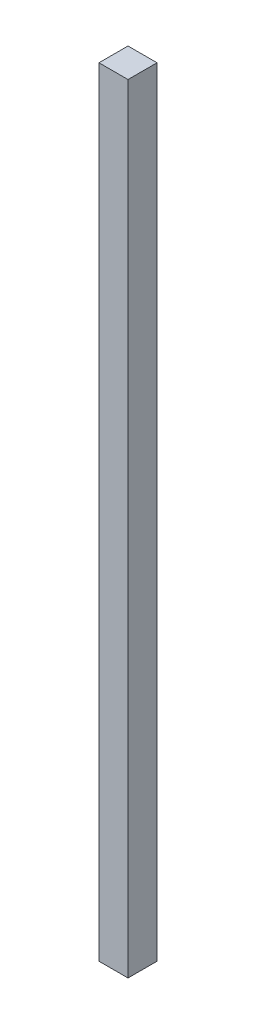
ISO-10303-21;
HEADER;
FILE_DESCRIPTION(('STEP AP214'),'2;1');
FILE_NAME('part.step','',(''),(''),'','','');
FILE_SCHEMA(('AUTOMOTIVE_DESIGN { 1 0 10303 214 1 1 1 1 }'));
ENDSEC;
DATA;
#1=APPLICATION_CONTEXT('core data for automotive mechanical design processes');
#2=APPLICATION_PROTOCOL_DEFINITION('international standard','automotive_design',2000,#1);
#3=PRODUCT_CONTEXT('',#1,'mechanical');
#4=PRODUCT('Part','Part','',(#3));
#5=PRODUCT_RELATED_PRODUCT_CATEGORY('part','',(#4));
#6=PRODUCT_DEFINITION_FORMATION('','',#4);
#7=PRODUCT_DEFINITION_CONTEXT('part definition',#1,'design');
#8=PRODUCT_DEFINITION('design','',#6,#7);
#9=PRODUCT_DEFINITION_SHAPE('','',#8);
#10=(LENGTH_UNIT() NAMED_UNIT(*) SI_UNIT(.MILLI.,.METRE.));
#11=(NAMED_UNIT(*) PLANE_ANGLE_UNIT() SI_UNIT($,.RADIAN.));
#12=(NAMED_UNIT(*) SI_UNIT($,.STERADIAN.) SOLID_ANGLE_UNIT());
#13=UNCERTAINTY_MEASURE_WITH_UNIT(LENGTH_MEASURE(1.E-05),#10,'distance_accuracy_value','');
#14=(GEOMETRIC_REPRESENTATION_CONTEXT(3) GLOBAL_UNCERTAINTY_ASSIGNED_CONTEXT((#13)) GLOBAL_UNIT_ASSIGNED_CONTEXT((#10,
#11,#12)) REPRESENTATION_CONTEXT('',''));
#15=CARTESIAN_POINT('',(0.,0.,0.));
#16=DIRECTION('',(0.,0.,1.));
#17=DIRECTION('',(1.,0.,0.));
#18=AXIS2_PLACEMENT_3D('',#15,#16,#17);
#19=CARTESIAN_POINT('',(0.,536.,0.));
#20=DIRECTION('',(1.,0.,0.));
#21=DIRECTION('',(0.,0.,-1.));
#22=AXIS2_PLACEMENT_3D('',#19,#20,#21);
#23=PLANE('',#22);
#24=DIRECTION('',(0.,0.,1.));
#25=VECTOR('',#24,1.);
#26=CARTESIAN_POINT('',(0.,0.,0.));
#27=LINE('',#26,#25);
#28=CARTESIAN_POINT('',(0.,0.,-20.));
#29=VERTEX_POINT('',#28);
#30=CARTESIAN_POINT('',(0.,0.,0.));
#31=VERTEX_POINT('',#30);
#32=EDGE_CURVE('E107',#29,#31,#27,.T.);
#33=ORIENTED_EDGE('',*,*,#32,.T.);
#34=DIRECTION('',(0.,-1.,0.));
#35=VECTOR('',#34,1.);
#36=CARTESIAN_POINT('',(0.,536.,0.));
#37=LINE('',#36,#35);
#38=CARTESIAN_POINT('',(0.,536.,0.));
#39=VERTEX_POINT('',#38);
#40=EDGE_CURVE('E11',#39,#31,#37,.T.);
#41=ORIENTED_EDGE('',*,*,#40,.F.);
#42=DIRECTION('',(0.,0.,1.));
#43=VECTOR('',#42,1.);
#44=CARTESIAN_POINT('',(0.,536.,0.));
#45=LINE('',#44,#43);
#46=CARTESIAN_POINT('',(0.,536.,-20.));
#47=VERTEX_POINT('',#46);
#48=EDGE_CURVE('E91',#47,#39,#45,.T.);
#49=ORIENTED_EDGE('',*,*,#48,.F.);
#50=DIRECTION('',(0.,-1.,0.));
#51=VECTOR('',#50,1.);
#52=CARTESIAN_POINT('',(0.,536.,-20.));
#53=LINE('',#52,#51);
#54=EDGE_CURVE('E103',#47,#29,#53,.T.);
#55=ORIENTED_EDGE('',*,*,#54,.T.);
#56=EDGE_LOOP('',(#33,#41,#49,#55));
#57=FACE_BOUND('',#56,.T.);
#58=ADVANCED_FACE('F39',(#57),#23,.F.);
#59=CARTESIAN_POINT('',(0.,536.,0.));
#60=DIRECTION('',(0.,0.,-1.));
#61=DIRECTION('',(-1.,0.,0.));
#62=AXIS2_PLACEMENT_3D('',#59,#60,#61);
#63=PLANE('',#62);
#64=DIRECTION('',(1.,0.,0.));
#65=VECTOR('',#64,1.);
#66=CARTESIAN_POINT('',(0.,0.,0.));
#67=LINE('',#66,#65);
#68=CARTESIAN_POINT('',(20.,0.,0.));
#69=VERTEX_POINT('',#68);
#70=EDGE_CURVE('E96',#31,#69,#67,.T.);
#71=ORIENTED_EDGE('',*,*,#70,.T.);
#72=DIRECTION('',(0.,-1.,0.));
#73=VECTOR('',#72,1.);
#74=CARTESIAN_POINT('',(20.,536.,0.));
#75=LINE('',#74,#73);
#76=CARTESIAN_POINT('',(20.,536.,0.));
#77=VERTEX_POINT('',#76);
#78=EDGE_CURVE('E48',#77,#69,#75,.T.);
#79=ORIENTED_EDGE('',*,*,#78,.F.);
#80=DIRECTION('',(1.,0.,0.));
#81=VECTOR('',#80,1.);
#82=CARTESIAN_POINT('',(0.,536.,0.));
#83=LINE('',#82,#81);
#84=EDGE_CURVE('E86',#39,#77,#83,.T.);
#85=ORIENTED_EDGE('',*,*,#84,.F.);
#86=ORIENTED_EDGE('',*,*,#40,.T.);
#87=EDGE_LOOP('',(#71,#79,#85,#86));
#88=FACE_BOUND('',#87,.T.);
#89=ADVANCED_FACE('F95',(#88),#63,.F.);
#90=CARTESIAN_POINT('',(20.,536.,0.));
#91=DIRECTION('',(-1.,0.,0.));
#92=DIRECTION('',(0.,0.,1.));
#93=AXIS2_PLACEMENT_3D('',#90,#91,#92);
#94=PLANE('',#93);
#95=DIRECTION('',(0.,0.,-1.));
#96=VECTOR('',#95,1.);
#97=CARTESIAN_POINT('',(20.,0.,0.));
#98=LINE('',#97,#96);
#99=CARTESIAN_POINT('',(20.,0.,-20.));
#100=VERTEX_POINT('',#99);
#101=EDGE_CURVE('E73',#69,#100,#98,.T.);
#102=ORIENTED_EDGE('',*,*,#101,.T.);
#103=DIRECTION('',(0.,-1.,0.));
#104=VECTOR('',#103,1.);
#105=CARTESIAN_POINT('',(20.,536.,-20.));
#106=LINE('',#105,#104);
#107=CARTESIAN_POINT('',(20.,536.,-20.));
#108=VERTEX_POINT('',#107);
#109=EDGE_CURVE('E98',#108,#100,#106,.T.);
#110=ORIENTED_EDGE('',*,*,#109,.F.);
#111=DIRECTION('',(0.,0.,-1.));
#112=VECTOR('',#111,1.);
#113=CARTESIAN_POINT('',(20.,536.,0.));
#114=LINE('',#113,#112);
#115=EDGE_CURVE('E89',#77,#108,#114,.T.);
#116=ORIENTED_EDGE('',*,*,#115,.F.);
#117=ORIENTED_EDGE('',*,*,#78,.T.);
#118=EDGE_LOOP('',(#102,#110,#116,#117));
#119=FACE_BOUND('',#118,.T.);
#120=ADVANCED_FACE('F99',(#119),#94,.F.);
#121=CARTESIAN_POINT('',(0.,536.,-20.));
#122=DIRECTION('',(0.,0.,1.));
#123=DIRECTION('',(1.,0.,0.));
#124=AXIS2_PLACEMENT_3D('',#121,#122,#123);
#125=PLANE('',#124);
#126=DIRECTION('',(-1.,0.,0.));
#127=VECTOR('',#126,1.);
#128=CARTESIAN_POINT('',(0.,0.,-20.));
#129=LINE('',#128,#127);
#130=EDGE_CURVE('E79',#100,#29,#129,.T.);
#131=ORIENTED_EDGE('',*,*,#130,.T.);
#132=ORIENTED_EDGE('',*,*,#54,.F.);
#133=DIRECTION('',(-1.,0.,0.));
#134=VECTOR('',#133,1.);
#135=CARTESIAN_POINT('',(0.,536.,-20.));
#136=LINE('',#135,#134);
#137=EDGE_CURVE('E56',#108,#47,#136,.T.);
#138=ORIENTED_EDGE('',*,*,#137,.F.);
#139=ORIENTED_EDGE('',*,*,#109,.T.);
#140=EDGE_LOOP('',(#131,#132,#138,#139));
#141=FACE_BOUND('',#140,.T.);
#142=ADVANCED_FACE('F120',(#141),#125,.F.);
#143=CARTESIAN_POINT('',(0.,536.,0.));
#144=DIRECTION('',(0.,-1.,0.));
#145=DIRECTION('',(0.,0.,-1.));
#146=AXIS2_PLACEMENT_3D('',#143,#144,#145);
#147=PLANE('',#146);
#148=ORIENTED_EDGE('',*,*,#48,.T.);
#149=ORIENTED_EDGE('',*,*,#84,.T.);
#150=ORIENTED_EDGE('',*,*,#115,.T.);
#151=ORIENTED_EDGE('',*,*,#137,.T.);
#152=EDGE_LOOP('',(#148,#149,#150,#151));
#153=FACE_BOUND('',#152,.T.);
#154=ADVANCED_FACE('F87',(#153),#147,.F.);
#155=CARTESIAN_POINT('',(0.,0.,0.));
#156=DIRECTION('',(0.,-1.,0.));
#157=DIRECTION('',(0.,0.,-1.));
#158=AXIS2_PLACEMENT_3D('',#155,#156,#157);
#159=PLANE('',#158);
#160=ORIENTED_EDGE('',*,*,#32,.F.);
#161=ORIENTED_EDGE('',*,*,#130,.F.);
#162=ORIENTED_EDGE('',*,*,#101,.F.);
#163=ORIENTED_EDGE('',*,*,#70,.F.);
#164=EDGE_LOOP('',(#160,#161,#162,#163));
#165=FACE_BOUND('',#164,.T.);
#166=ADVANCED_FACE('F123',(#165),#159,.T.);
#167=CLOSED_SHELL('',(#58,#89,#120,#142,#154,#166));
#168=MANIFOLD_SOLID_BREP('B2',#167);
#169=ADVANCED_BREP_SHAPE_REPRESENTATION('',(#18,#168),#14);
#170=SHAPE_DEFINITION_REPRESENTATION(#9,#169);
ENDSEC;
END-ISO-10303-21;
